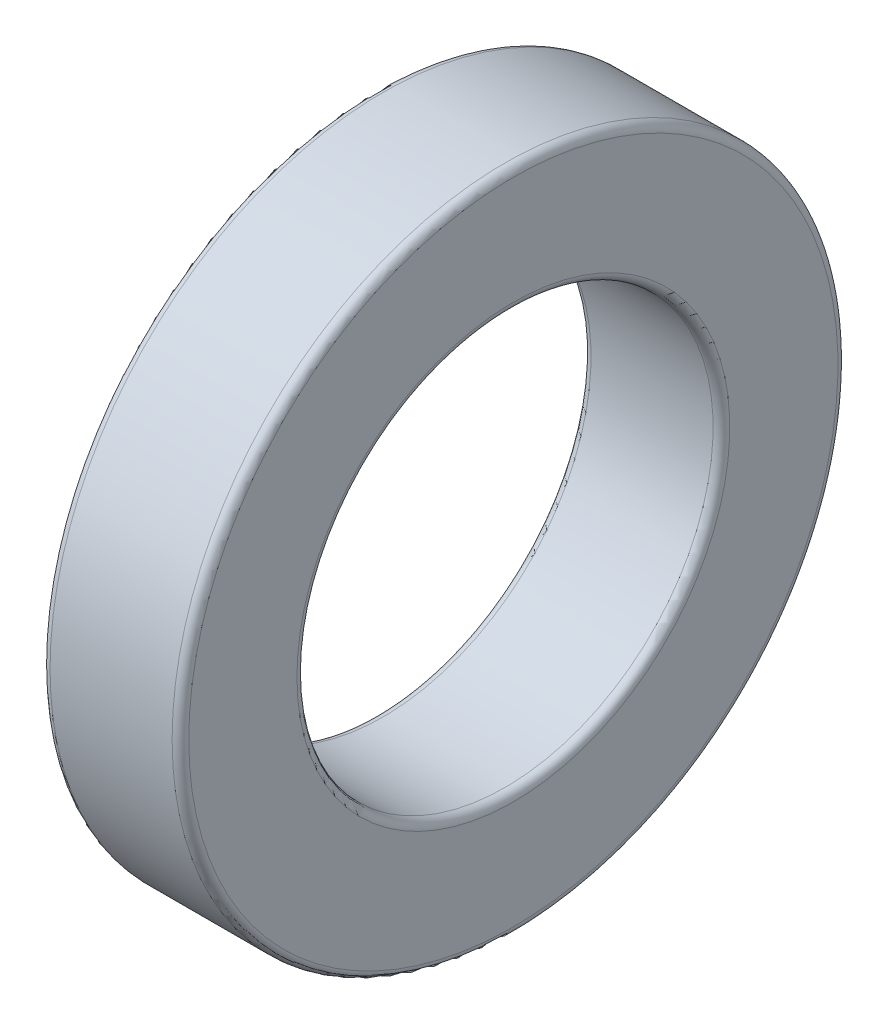
ISO-10303-21;
HEADER;
FILE_DESCRIPTION(('STEP AP214'),'2;1');
FILE_NAME('part.step','',(''),(''),'','','');
FILE_SCHEMA(('AUTOMOTIVE_DESIGN { 1 0 10303 214 1 1 1 1 }'));
ENDSEC;
DATA;
#1=APPLICATION_CONTEXT('core data for automotive mechanical design processes');
#2=APPLICATION_PROTOCOL_DEFINITION('international standard','automotive_design',2000,#1);
#3=PRODUCT_CONTEXT('',#1,'mechanical');
#4=PRODUCT('Part','Part','',(#3));
#5=PRODUCT_RELATED_PRODUCT_CATEGORY('part','',(#4));
#6=PRODUCT_DEFINITION_FORMATION('','',#4);
#7=PRODUCT_DEFINITION_CONTEXT('part definition',#1,'design');
#8=PRODUCT_DEFINITION('design','',#6,#7);
#9=PRODUCT_DEFINITION_SHAPE('','',#8);
#10=(LENGTH_UNIT() NAMED_UNIT(*) SI_UNIT(.MILLI.,.METRE.));
#11=(NAMED_UNIT(*) PLANE_ANGLE_UNIT() SI_UNIT($,.RADIAN.));
#12=(NAMED_UNIT(*) SI_UNIT($,.STERADIAN.) SOLID_ANGLE_UNIT());
#13=UNCERTAINTY_MEASURE_WITH_UNIT(LENGTH_MEASURE(1.E-05),#10,'distance_accuracy_value','');
#14=(GEOMETRIC_REPRESENTATION_CONTEXT(3) GLOBAL_UNCERTAINTY_ASSIGNED_CONTEXT((#13)) GLOBAL_UNIT_ASSIGNED_CONTEXT((#10,
#11,#12)) REPRESENTATION_CONTEXT('',''));
#15=CARTESIAN_POINT('',(0.,0.,0.));
#16=DIRECTION('',(0.,0.,1.));
#17=DIRECTION('',(1.,0.,0.));
#18=AXIS2_PLACEMENT_3D('',#15,#16,#17);
#19=CARTESIAN_POINT('',(0.3,0.,0.));
#20=DIRECTION('',(-1.,0.,0.));
#21=DIRECTION('',(0.,0.,1.));
#22=AXIS2_PLACEMENT_3D('',#19,#20,#21);
#23=CYLINDRICAL_SURFACE('',#22,7.5);
#24=CARTESIAN_POINT('',(4.7,0.,0.));
#25=DIRECTION('',(-1.,0.,0.));
#26=DIRECTION('',(0.,0.,1.));
#27=AXIS2_PLACEMENT_3D('',#24,#25,#26);
#28=CIRCLE('',#27,7.5);
#29=CARTESIAN_POINT('',(4.7,0.,7.5));
#30=VERTEX_POINT('',#29);
#31=EDGE_CURVE('E10',#30,#30,#28,.T.);
#32=ORIENTED_EDGE('',*,*,#31,.F.);
#33=EDGE_LOOP('',(#32));
#34=FACE_BOUND('',#33,.T.);
#35=CARTESIAN_POINT('',(0.3,0.,0.));
#36=DIRECTION('',(-1.,0.,0.));
#37=DIRECTION('',(0.,0.,1.));
#38=AXIS2_PLACEMENT_3D('',#35,#36,#37);
#39=CIRCLE('',#38,7.5);
#40=CARTESIAN_POINT('',(0.3,0.,7.5));
#41=VERTEX_POINT('',#40);
#42=EDGE_CURVE('E84',#41,#41,#39,.T.);
#43=ORIENTED_EDGE('',*,*,#42,.T.);
#44=EDGE_LOOP('',(#43));
#45=FACE_BOUND('',#44,.T.);
#46=ADVANCED_FACE('F15',(#34,#45),#23,.F.);
#47=CARTESIAN_POINT('',(4.7,0.,0.));
#48=DIRECTION('',(-1.,0.,0.));
#49=DIRECTION('',(0.,0.,1.));
#50=AXIS2_PLACEMENT_3D('',#47,#48,#49);
#51=TOROIDAL_SURFACE('',#50,7.8,0.3);
#52=CARTESIAN_POINT('',(5.,0.,0.));
#53=DIRECTION('',(-1.,0.,0.));
#54=DIRECTION('',(0.,0.,1.));
#55=AXIS2_PLACEMENT_3D('',#52,#53,#54);
#56=CIRCLE('',#55,7.8);
#57=CARTESIAN_POINT('',(5.,0.,7.8));
#58=VERTEX_POINT('',#57);
#59=EDGE_CURVE('E24',#58,#58,#56,.T.);
#60=ORIENTED_EDGE('',*,*,#59,.F.);
#61=EDGE_LOOP('',(#60));
#62=FACE_BOUND('',#61,.T.);
#63=ORIENTED_EDGE('',*,*,#31,.T.);
#64=EDGE_LOOP('',(#63));
#65=FACE_BOUND('',#64,.T.);
#66=ADVANCED_FACE('F114',(#62,#65),#51,.T.);
#67=CARTESIAN_POINT('',(5.,7.8,0.));
#68=DIRECTION('',(-1.,0.,0.));
#69=DIRECTION('',(0.,0.,1.));
#70=AXIS2_PLACEMENT_3D('',#67,#68,#69);
#71=PLANE('',#70);
#72=CARTESIAN_POINT('',(5.,0.,0.));
#73=DIRECTION('',(-1.,0.,0.));
#74=DIRECTION('',(0.,0.,1.));
#75=AXIS2_PLACEMENT_3D('',#72,#73,#74);
#76=CIRCLE('',#75,11.7);
#77=CARTESIAN_POINT('',(5.,0.,11.7));
#78=VERTEX_POINT('',#77);
#79=EDGE_CURVE('E34',#78,#78,#76,.T.);
#80=ORIENTED_EDGE('',*,*,#79,.F.);
#81=EDGE_LOOP('',(#80));
#82=FACE_BOUND('',#81,.T.);
#83=ORIENTED_EDGE('',*,*,#59,.T.);
#84=EDGE_LOOP('',(#83));
#85=FACE_BOUND('',#84,.T.);
#86=ADVANCED_FACE('F111',(#82,#85),#71,.F.);
#87=CARTESIAN_POINT('',(4.7,0.,0.));
#88=DIRECTION('',(-1.,0.,0.));
#89=DIRECTION('',(0.,0.,1.));
#90=AXIS2_PLACEMENT_3D('',#87,#88,#89);
#91=TOROIDAL_SURFACE('',#90,11.7,0.3);
#92=CARTESIAN_POINT('',(4.7,0.,0.));
#93=DIRECTION('',(-1.,0.,0.));
#94=DIRECTION('',(0.,0.,1.));
#95=AXIS2_PLACEMENT_3D('',#92,#93,#94);
#96=CIRCLE('',#95,12.);
#97=CARTESIAN_POINT('',(4.7,0.,12.));
#98=VERTEX_POINT('',#97);
#99=EDGE_CURVE('E99',#98,#98,#96,.T.);
#100=ORIENTED_EDGE('',*,*,#99,.F.);
#101=EDGE_LOOP('',(#100));
#102=FACE_BOUND('',#101,.T.);
#103=ORIENTED_EDGE('',*,*,#79,.T.);
#104=EDGE_LOOP('',(#103));
#105=FACE_BOUND('',#104,.T.);
#106=ADVANCED_FACE('F109',(#102,#105),#91,.T.);
#107=CARTESIAN_POINT('',(0.3,0.,0.));
#108=DIRECTION('',(-1.,0.,0.));
#109=DIRECTION('',(0.,0.,1.));
#110=AXIS2_PLACEMENT_3D('',#107,#108,#109);
#111=CYLINDRICAL_SURFACE('',#110,12.);
#112=CARTESIAN_POINT('',(0.3,0.,0.));
#113=DIRECTION('',(-1.,0.,0.));
#114=DIRECTION('',(0.,0.,1.));
#115=AXIS2_PLACEMENT_3D('',#112,#113,#114);
#116=CIRCLE('',#115,12.);
#117=CARTESIAN_POINT('',(0.3,0.,12.));
#118=VERTEX_POINT('',#117);
#119=EDGE_CURVE('E95',#118,#118,#116,.T.);
#120=ORIENTED_EDGE('',*,*,#119,.F.);
#121=EDGE_LOOP('',(#120));
#122=FACE_BOUND('',#121,.T.);
#123=ORIENTED_EDGE('',*,*,#99,.T.);
#124=EDGE_LOOP('',(#123));
#125=FACE_BOUND('',#124,.T.);
#126=ADVANCED_FACE('F127',(#122,#125),#111,.T.);
#127=CARTESIAN_POINT('',(0.3,0.,0.));
#128=DIRECTION('',(-1.,0.,0.));
#129=DIRECTION('',(0.,0.,1.));
#130=AXIS2_PLACEMENT_3D('',#127,#128,#129);
#131=TOROIDAL_SURFACE('',#130,11.7,0.3);
#132=CARTESIAN_POINT('',(0.,0.,0.));
#133=DIRECTION('',(-1.,0.,0.));
#134=DIRECTION('',(0.,0.,1.));
#135=AXIS2_PLACEMENT_3D('',#132,#133,#134);
#136=CIRCLE('',#135,11.7);
#137=CARTESIAN_POINT('',(0.,0.,11.7));
#138=VERTEX_POINT('',#137);
#139=EDGE_CURVE('E91',#138,#138,#136,.T.);
#140=ORIENTED_EDGE('',*,*,#139,.F.);
#141=EDGE_LOOP('',(#140));
#142=FACE_BOUND('',#141,.T.);
#143=ORIENTED_EDGE('',*,*,#119,.T.);
#144=EDGE_LOOP('',(#143));
#145=FACE_BOUND('',#144,.T.);
#146=ADVANCED_FACE('F131',(#142,#145),#131,.T.);
#147=CARTESIAN_POINT('',(0.,7.8,0.));
#148=DIRECTION('',(-1.,0.,0.));
#149=DIRECTION('',(0.,0.,1.));
#150=AXIS2_PLACEMENT_3D('',#147,#148,#149);
#151=PLANE('',#150);
#152=ORIENTED_EDGE('',*,*,#139,.T.);
#153=EDGE_LOOP('',(#152));
#154=FACE_BOUND('',#153,.T.);
#155=CARTESIAN_POINT('',(0.,0.,0.));
#156=DIRECTION('',(-1.,0.,0.));
#157=DIRECTION('',(0.,0.,1.));
#158=AXIS2_PLACEMENT_3D('',#155,#156,#157);
#159=CIRCLE('',#158,7.8);
#160=CARTESIAN_POINT('',(0.,0.,7.8));
#161=VERTEX_POINT('',#160);
#162=EDGE_CURVE('E87',#161,#161,#159,.T.);
#163=ORIENTED_EDGE('',*,*,#162,.F.);
#164=EDGE_LOOP('',(#163));
#165=FACE_BOUND('',#164,.T.);
#166=ADVANCED_FACE('F135',(#154,#165),#151,.T.);
#167=CARTESIAN_POINT('',(0.3,0.,0.));
#168=DIRECTION('',(-1.,0.,0.));
#169=DIRECTION('',(0.,0.,1.));
#170=AXIS2_PLACEMENT_3D('',#167,#168,#169);
#171=TOROIDAL_SURFACE('',#170,7.8,0.3);
#172=ORIENTED_EDGE('',*,*,#42,.F.);
#173=EDGE_LOOP('',(#172));
#174=FACE_BOUND('',#173,.T.);
#175=ORIENTED_EDGE('',*,*,#162,.T.);
#176=EDGE_LOOP('',(#175));
#177=FACE_BOUND('',#176,.T.);
#178=ADVANCED_FACE('F139',(#174,#177),#171,.T.);
#179=CLOSED_SHELL('',(#46,#66,#86,#106,#126,#146,#166,#178));
#180=CARTESIAN_POINT('',(0.9375,0.,0.));
#181=DIRECTION('',(-1.,0.,0.));
#182=DIRECTION('',(0.,0.,-1.));
#183=AXIS2_PLACEMENT_3D('',#180,#181,#182);
#184=CYLINDRICAL_SURFACE('',#183,9.6);
#185=CARTESIAN_POINT('',(2.35,0.,0.));
#186=DIRECTION('',(-1.,0.,0.));
#187=DIRECTION('',(0.,-1.,0.));
#188=AXIS2_PLACEMENT_3D('',#185,#186,#187);
#189=CIRCLE('',#188,9.6);
#190=CARTESIAN_POINT('',(2.35,-9.6,0.));
#191=VERTEX_POINT('',#190);
#192=EDGE_CURVE('E64',#191,#191,#189,.T.);
#193=ORIENTED_EDGE('',*,*,#192,.T.);
#194=EDGE_LOOP('',(#193));
#195=FACE_BOUND('',#194,.T.);
#196=CARTESIAN_POINT('',(0.9375,0.,0.));
#197=DIRECTION('',(-1.,0.,0.));
#198=DIRECTION('',(0.,0.,-1.));
#199=AXIS2_PLACEMENT_3D('',#196,#197,#198);
#200=CIRCLE('',#199,9.6);
#201=CARTESIAN_POINT('',(0.9375,0.,-9.6));
#202=VERTEX_POINT('',#201);
#203=EDGE_CURVE('E80',#202,#202,#200,.T.);
#204=ORIENTED_EDGE('',*,*,#203,.F.);
#205=EDGE_LOOP('',(#204));
#206=FACE_BOUND('',#205,.T.);
#207=ADVANCED_FACE('F150',(#195,#206),#184,.T.);
#208=CARTESIAN_POINT('',(0.9375,0.,0.));
#209=DIRECTION('',(-1.,0.,0.));
#210=DIRECTION('',(0.,0.,-1.));
#211=AXIS2_PLACEMENT_3D('',#208,#209,#210);
#212=CYLINDRICAL_SURFACE('',#211,9.9);
#213=CARTESIAN_POINT('',(2.35,0.,0.));
#214=DIRECTION('',(-1.,0.,0.));
#215=DIRECTION('',(0.,-1.,0.));
#216=AXIS2_PLACEMENT_3D('',#213,#214,#215);
#217=CIRCLE('',#216,9.9);
#218=CARTESIAN_POINT('',(2.35,-9.9,0.));
#219=VERTEX_POINT('',#218);
#220=EDGE_CURVE('E18',#219,#219,#217,.F.);
#221=ORIENTED_EDGE('',*,*,#220,.T.);
#222=EDGE_LOOP('',(#221));
#223=FACE_BOUND('',#222,.T.);
#224=CARTESIAN_POINT('',(0.9375,0.,0.));
#225=DIRECTION('',(-1.,0.,0.));
#226=DIRECTION('',(0.,0.,-1.));
#227=AXIS2_PLACEMENT_3D('',#224,#225,#226);
#228=CIRCLE('',#227,9.9);
#229=CARTESIAN_POINT('',(0.9375,0.,-9.9));
#230=VERTEX_POINT('',#229);
#231=EDGE_CURVE('E76',#230,#230,#228,.T.);
#232=ORIENTED_EDGE('',*,*,#231,.T.);
#233=EDGE_LOOP('',(#232));
#234=FACE_BOUND('',#233,.T.);
#235=ADVANCED_FACE('F156',(#223,#234),#212,.F.);
#236=CARTESIAN_POINT('',(0.9375,-9.6,0.));
#237=DIRECTION('',(-1.,0.,0.));
#238=DIRECTION('',(0.,0.,-1.));
#239=AXIS2_PLACEMENT_3D('',#236,#237,#238);
#240=PLANE('',#239);
#241=ORIENTED_EDGE('',*,*,#231,.F.);
#242=EDGE_LOOP('',(#241));
#243=FACE_BOUND('',#242,.T.);
#244=ORIENTED_EDGE('',*,*,#203,.T.);
#245=EDGE_LOOP('',(#244));
#246=FACE_BOUND('',#245,.T.);
#247=ADVANCED_FACE('F152',(#243,#246),#240,.F.);
#248=CARTESIAN_POINT('',(2.35,-9.,0.));
#249=DIRECTION('',(-1.,0.,0.));
#250=DIRECTION('',(0.,0.,-1.));
#251=AXIS2_PLACEMENT_3D('',#248,#249,#250);
#252=PLANE('',#251);
#253=CARTESIAN_POINT('',(2.35,0.,0.));
#254=DIRECTION('',(-1.,0.,0.));
#255=DIRECTION('',(0.,0.,-1.));
#256=AXIS2_PLACEMENT_3D('',#253,#254,#255);
#257=CIRCLE('',#256,10.5);
#258=CARTESIAN_POINT('',(2.35,0.,-10.5));
#259=VERTEX_POINT('',#258);
#260=EDGE_CURVE('E52',#259,#259,#257,.T.);
#261=ORIENTED_EDGE('',*,*,#260,.F.);
#262=EDGE_LOOP('',(#261));
#263=FACE_BOUND('',#262,.T.);
#264=ORIENTED_EDGE('',*,*,#220,.F.);
#265=EDGE_LOOP('',(#264));
#266=FACE_BOUND('',#265,.T.);
#267=ADVANCED_FACE('F155',(#263,#266),#252,.F.);
#268=CARTESIAN_POINT('',(2.35,0.,0.));
#269=DIRECTION('',(-1.,0.,0.));
#270=DIRECTION('',(0.,0.,-1.));
#271=AXIS2_PLACEMENT_3D('',#268,#269,#270);
#272=CYLINDRICAL_SURFACE('',#271,10.5);
#273=CARTESIAN_POINT('',(2.65,0.,0.));
#274=DIRECTION('',(-1.,0.,0.));
#275=DIRECTION('',(0.,0.,-1.));
#276=AXIS2_PLACEMENT_3D('',#273,#274,#275);
#277=CIRCLE('',#276,10.5);
#278=CARTESIAN_POINT('',(2.65,0.,-10.5));
#279=VERTEX_POINT('',#278);
#280=EDGE_CURVE('E60',#279,#279,#277,.T.);
#281=ORIENTED_EDGE('',*,*,#280,.F.);
#282=EDGE_LOOP('',(#281));
#283=FACE_BOUND('',#282,.T.);
#284=ORIENTED_EDGE('',*,*,#260,.T.);
#285=EDGE_LOOP('',(#284));
#286=FACE_BOUND('',#285,.T.);
#287=ADVANCED_FACE('F172',(#283,#286),#272,.F.);
#288=CARTESIAN_POINT('',(2.65,-10.5,0.));
#289=DIRECTION('',(1.,0.,0.));
#290=DIRECTION('',(0.,0.,1.));
#291=AXIS2_PLACEMENT_3D('',#288,#289,#290);
#292=PLANE('',#291);
#293=ORIENTED_EDGE('',*,*,#280,.T.);
#294=EDGE_LOOP('',(#293));
#295=FACE_BOUND('',#294,.T.);
#296=CARTESIAN_POINT('',(2.65,0.,0.));
#297=DIRECTION('',(1.,0.,0.));
#298=DIRECTION('',(0.,1.,0.));
#299=AXIS2_PLACEMENT_3D('',#296,#297,#298);
#300=CIRCLE('',#299,9.9);
#301=CARTESIAN_POINT('',(2.65,9.9,0.));
#302=VERTEX_POINT('',#301);
#303=EDGE_CURVE('E37',#302,#302,#300,.F.);
#304=ORIENTED_EDGE('',*,*,#303,.F.);
#305=EDGE_LOOP('',(#304));
#306=FACE_BOUND('',#305,.T.);
#307=ADVANCED_FACE('F171',(#295,#306),#292,.F.);
#308=CARTESIAN_POINT('',(2.35,0.,0.));
#309=DIRECTION('',(-1.,0.,0.));
#310=DIRECTION('',(0.,0.,-1.));
#311=AXIS2_PLACEMENT_3D('',#308,#309,#310);
#312=CIRCLE('',#311,9.);
#313=CARTESIAN_POINT('',(2.35,0.,-9.));
#314=VERTEX_POINT('',#313);
#315=EDGE_CURVE('E41',#314,#314,#312,.T.);
#316=ORIENTED_EDGE('',*,*,#315,.T.);
#317=EDGE_LOOP('',(#316));
#318=FACE_BOUND('',#317,.T.);
#319=ORIENTED_EDGE('',*,*,#192,.F.);
#320=EDGE_LOOP('',(#319));
#321=FACE_BOUND('',#320,.T.);
#322=ADVANCED_FACE('F168',(#318,#321),#252,.F.);
#323=CARTESIAN_POINT('',(2.65,0.,0.));
#324=DIRECTION('',(-1.,0.,0.));
#325=DIRECTION('',(0.,0.,-1.));
#326=AXIS2_PLACEMENT_3D('',#323,#324,#325);
#327=CIRCLE('',#326,9.);
#328=CARTESIAN_POINT('',(2.65,0.,-9.));
#329=VERTEX_POINT('',#328);
#330=EDGE_CURVE('E236',#329,#329,#327,.T.);
#331=ORIENTED_EDGE('',*,*,#330,.F.);
#332=EDGE_LOOP('',(#331));
#333=FACE_BOUND('',#332,.T.);
#334=CARTESIAN_POINT('',(2.65,0.,0.));
#335=DIRECTION('',(1.,0.,0.));
#336=DIRECTION('',(0.,1.,0.));
#337=AXIS2_PLACEMENT_3D('',#334,#335,#336);
#338=CIRCLE('',#337,9.6);
#339=CARTESIAN_POINT('',(2.65,9.6,0.));
#340=VERTEX_POINT('',#339);
#341=EDGE_CURVE('E40',#340,#340,#338,.T.);
#342=ORIENTED_EDGE('',*,*,#341,.F.);
#343=EDGE_LOOP('',(#342));
#344=FACE_BOUND('',#343,.T.);
#345=ADVANCED_FACE('F166',(#333,#344),#292,.F.);
#346=CARTESIAN_POINT('',(2.35,0.,0.));
#347=DIRECTION('',(-1.,0.,0.));
#348=DIRECTION('',(0.,0.,-1.));
#349=AXIS2_PLACEMENT_3D('',#346,#347,#348);
#350=CYLINDRICAL_SURFACE('',#349,9.);
#351=ORIENTED_EDGE('',*,*,#315,.F.);
#352=EDGE_LOOP('',(#351));
#353=FACE_BOUND('',#352,.T.);
#354=ORIENTED_EDGE('',*,*,#330,.T.);
#355=EDGE_LOOP('',(#354));
#356=FACE_BOUND('',#355,.T.);
#357=ADVANCED_FACE('F148',(#353,#356),#350,.T.);
#358=ORIENTED_EDGE('',*,*,#341,.T.);
#359=EDGE_LOOP('',(#358));
#360=FACE_BOUND('',#359,.T.);
#361=CARTESIAN_POINT('',(4.0625,0.,0.));
#362=DIRECTION('',(-1.,0.,0.));
#363=DIRECTION('',(0.,0.,-1.));
#364=AXIS2_PLACEMENT_3D('',#361,#362,#363);
#365=CIRCLE('',#364,9.6);
#366=CARTESIAN_POINT('',(4.0625,0.,-9.6));
#367=VERTEX_POINT('',#366);
#368=EDGE_CURVE('E68',#367,#367,#365,.T.);
#369=ORIENTED_EDGE('',*,*,#368,.T.);
#370=EDGE_LOOP('',(#369));
#371=FACE_BOUND('',#370,.T.);
#372=ADVANCED_FACE('F144',(#360,#371),#184,.T.);
#373=CARTESIAN_POINT('',(4.0625,-9.9,0.));
#374=DIRECTION('',(1.,0.,0.));
#375=DIRECTION('',(0.,0.,1.));
#376=AXIS2_PLACEMENT_3D('',#373,#374,#375);
#377=PLANE('',#376);
#378=ORIENTED_EDGE('',*,*,#368,.F.);
#379=EDGE_LOOP('',(#378));
#380=FACE_BOUND('',#379,.T.);
#381=CARTESIAN_POINT('',(4.0625,0.,0.));
#382=DIRECTION('',(-1.,0.,0.));
#383=DIRECTION('',(0.,0.,-1.));
#384=AXIS2_PLACEMENT_3D('',#381,#382,#383);
#385=CIRCLE('',#384,9.9);
#386=CARTESIAN_POINT('',(4.0625,0.,-9.9));
#387=VERTEX_POINT('',#386);
#388=EDGE_CURVE('E72',#387,#387,#385,.T.);
#389=ORIENTED_EDGE('',*,*,#388,.T.);
#390=EDGE_LOOP('',(#389));
#391=FACE_BOUND('',#390,.T.);
#392=ADVANCED_FACE('F147',(#380,#391),#377,.F.);
#393=ORIENTED_EDGE('',*,*,#303,.T.);
#394=EDGE_LOOP('',(#393));
#395=FACE_BOUND('',#394,.T.);
#396=ORIENTED_EDGE('',*,*,#388,.F.);
#397=EDGE_LOOP('',(#396));
#398=FACE_BOUND('',#397,.T.);
#399=ADVANCED_FACE('F158',(#395,#398),#212,.F.);
#400=CLOSED_SHELL('',(#207,#235,#247,#267,#287,#307,#322,#345,#357,#372,#392,#399));
#401=ORIENTED_CLOSED_SHELL('',*,#400,.T.);
#402=BREP_WITH_VOIDS('B1',#179,(#401));
#403=ADVANCED_BREP_SHAPE_REPRESENTATION('',(#18,#402),#14);
#404=SHAPE_DEFINITION_REPRESENTATION(#9,#403);
ENDSEC;
END-ISO-10303-21;
